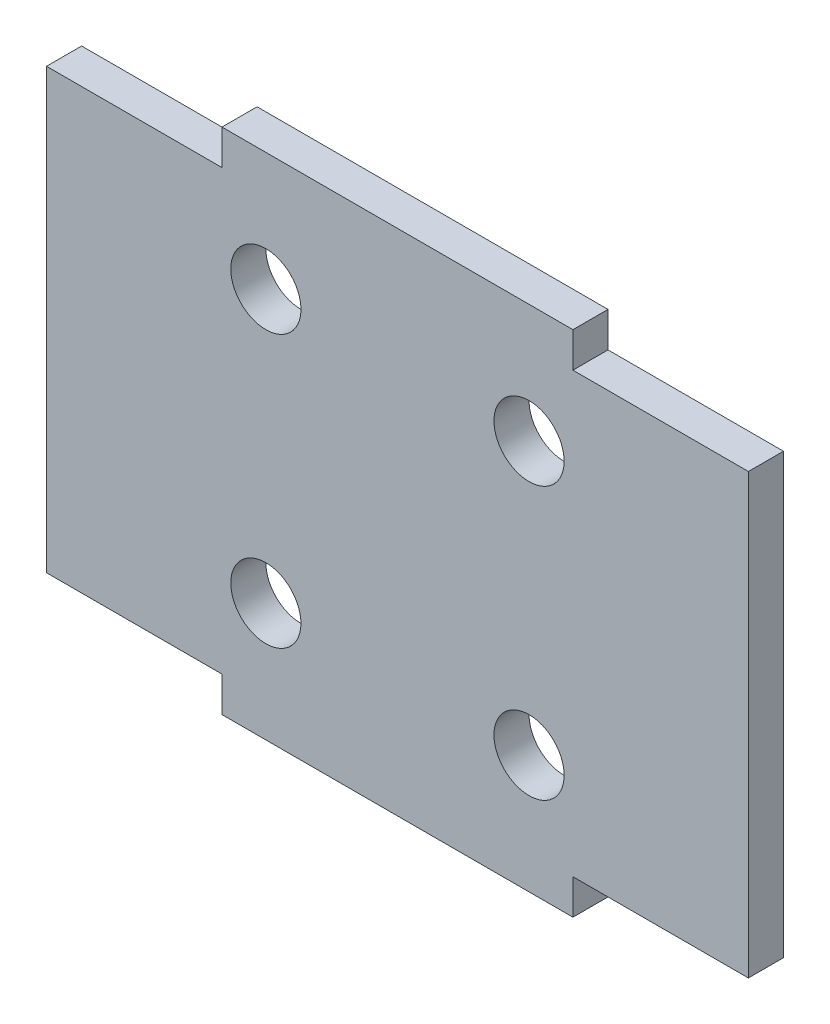
ISO-10303-21;
HEADER;
FILE_DESCRIPTION(('STEP AP214'),'2;1');
FILE_NAME('part.step','',(''),(''),'','','');
FILE_SCHEMA(('AUTOMOTIVE_DESIGN { 1 0 10303 214 1 1 1 1 }'));
ENDSEC;
DATA;
#1=APPLICATION_CONTEXT('core data for automotive mechanical design processes');
#2=APPLICATION_PROTOCOL_DEFINITION('international standard','automotive_design',2000,#1);
#3=PRODUCT_CONTEXT('',#1,'mechanical');
#4=PRODUCT('Part','Part','',(#3));
#5=PRODUCT_RELATED_PRODUCT_CATEGORY('part','',(#4));
#6=PRODUCT_DEFINITION_FORMATION('','',#4);
#7=PRODUCT_DEFINITION_CONTEXT('part definition',#1,'design');
#8=PRODUCT_DEFINITION('design','',#6,#7);
#9=PRODUCT_DEFINITION_SHAPE('','',#8);
#10=(LENGTH_UNIT() NAMED_UNIT(*) SI_UNIT(.MILLI.,.METRE.));
#11=(NAMED_UNIT(*) PLANE_ANGLE_UNIT() SI_UNIT($,.RADIAN.));
#12=(NAMED_UNIT(*) SI_UNIT($,.STERADIAN.) SOLID_ANGLE_UNIT());
#13=UNCERTAINTY_MEASURE_WITH_UNIT(LENGTH_MEASURE(1.E-05),#10,'distance_accuracy_value','');
#14=(GEOMETRIC_REPRESENTATION_CONTEXT(3) GLOBAL_UNCERTAINTY_ASSIGNED_CONTEXT((#13)) GLOBAL_UNIT_ASSIGNED_CONTEXT((#10,
#11,#12)) REPRESENTATION_CONTEXT('',''));
#15=CARTESIAN_POINT('',(0.,0.,0.));
#16=DIRECTION('',(0.,0.,1.));
#17=DIRECTION('',(1.,0.,0.));
#18=AXIS2_PLACEMENT_3D('',#15,#16,#17);
#19=CARTESIAN_POINT('',(0.,0.,4.));
#20=DIRECTION('',(0.,0.,1.));
#21=DIRECTION('',(1.,0.,0.));
#22=AXIS2_PLACEMENT_3D('',#19,#20,#21);
#23=PLANE('',#22);
#24=CARTESIAN_POINT('',(-15.,-15.5,4.));
#25=DIRECTION('',(0.,0.,1.));
#26=DIRECTION('',(1.,0.,0.));
#27=AXIS2_PLACEMENT_3D('',#24,#25,#26);
#28=CIRCLE('',#27,3.99999999999999);
#29=CARTESIAN_POINT('',(-11.,-15.5,4.));
#30=VERTEX_POINT('',#29);
#31=EDGE_CURVE('E180',#30,#30,#28,.T.);
#32=ORIENTED_EDGE('',*,*,#31,.F.);
#33=EDGE_LOOP('',(#32));
#34=FACE_BOUND('',#33,.T.);
#35=CARTESIAN_POINT('',(15.,15.5,4.));
#36=DIRECTION('',(0.,0.,1.));
#37=DIRECTION('',(1.,0.,0.));
#38=AXIS2_PLACEMENT_3D('',#35,#36,#37);
#39=CIRCLE('',#38,4.);
#40=CARTESIAN_POINT('',(19.,15.5,4.));
#41=VERTEX_POINT('',#40);
#42=EDGE_CURVE('E181',#41,#41,#39,.T.);
#43=ORIENTED_EDGE('',*,*,#42,.F.);
#44=EDGE_LOOP('',(#43));
#45=FACE_BOUND('',#44,.T.);
#46=DIRECTION('',(0.,-1.,0.));
#47=VECTOR('',#46,1.);
#48=CARTESIAN_POINT('',(-20.,29.,4.));
#49=LINE('',#48,#47);
#50=CARTESIAN_POINT('',(-20.,29.,4.));
#51=VERTEX_POINT('',#50);
#52=CARTESIAN_POINT('',(-20.,25.,4.));
#53=VERTEX_POINT('',#52);
#54=EDGE_CURVE('E194',#51,#53,#49,.T.);
#55=ORIENTED_EDGE('',*,*,#54,.T.);
#56=DIRECTION('',(-1.,0.,0.));
#57=VECTOR('',#56,1.);
#58=CARTESIAN_POINT('',(-40.,25.,4.));
#59=LINE('',#58,#57);
#60=CARTESIAN_POINT('',(-40.,25.,4.));
#61=VERTEX_POINT('',#60);
#62=EDGE_CURVE('E108',#53,#61,#59,.T.);
#63=ORIENTED_EDGE('',*,*,#62,.T.);
#64=DIRECTION('',(0.,-1.,0.));
#65=VECTOR('',#64,1.);
#66=CARTESIAN_POINT('',(-40.,25.,4.));
#67=LINE('',#66,#65);
#68=CARTESIAN_POINT('',(-40.,-25.,4.));
#69=VERTEX_POINT('',#68);
#70=EDGE_CURVE('E200',#61,#69,#67,.T.);
#71=ORIENTED_EDGE('',*,*,#70,.T.);
#72=DIRECTION('',(1.,0.,0.));
#73=VECTOR('',#72,1.);
#74=CARTESIAN_POINT('',(-40.,-25.,4.));
#75=LINE('',#74,#73);
#76=CARTESIAN_POINT('',(-20.,-25.,4.));
#77=VERTEX_POINT('',#76);
#78=EDGE_CURVE('E204',#69,#77,#75,.T.);
#79=ORIENTED_EDGE('',*,*,#78,.T.);
#80=DIRECTION('',(0.,-1.,0.));
#81=VECTOR('',#80,1.);
#82=CARTESIAN_POINT('',(-20.,-29.,4.));
#83=LINE('',#82,#81);
#84=CARTESIAN_POINT('',(-20.,-29.,4.));
#85=VERTEX_POINT('',#84);
#86=EDGE_CURVE('E212',#77,#85,#83,.T.);
#87=ORIENTED_EDGE('',*,*,#86,.T.);
#88=DIRECTION('',(1.,0.,0.));
#89=VECTOR('',#88,1.);
#90=CARTESIAN_POINT('',(-20.,-29.,4.));
#91=LINE('',#90,#89);
#92=CARTESIAN_POINT('',(20.,-29.,4.));
#93=VERTEX_POINT('',#92);
#94=EDGE_CURVE('E215',#85,#93,#91,.T.);
#95=ORIENTED_EDGE('',*,*,#94,.T.);
#96=DIRECTION('',(0.,1.,0.));
#97=VECTOR('',#96,1.);
#98=CARTESIAN_POINT('',(20.,-29.,4.));
#99=LINE('',#98,#97);
#100=CARTESIAN_POINT('',(20.,-25.,4.));
#101=VERTEX_POINT('',#100);
#102=EDGE_CURVE('E219',#93,#101,#99,.T.);
#103=ORIENTED_EDGE('',*,*,#102,.T.);
#104=DIRECTION('',(1.,0.,0.));
#105=VECTOR('',#104,1.);
#106=CARTESIAN_POINT('',(40.,-25.,4.));
#107=LINE('',#106,#105);
#108=CARTESIAN_POINT('',(40.,-25.,4.));
#109=VERTEX_POINT('',#108);
#110=EDGE_CURVE('E223',#101,#109,#107,.T.);
#111=ORIENTED_EDGE('',*,*,#110,.T.);
#112=DIRECTION('',(0.,1.,0.));
#113=VECTOR('',#112,1.);
#114=CARTESIAN_POINT('',(40.,25.,4.));
#115=LINE('',#114,#113);
#116=CARTESIAN_POINT('',(40.,25.,4.));
#117=VERTEX_POINT('',#116);
#118=EDGE_CURVE('E139',#109,#117,#115,.T.);
#119=ORIENTED_EDGE('',*,*,#118,.T.);
#120=DIRECTION('',(-1.,0.,0.));
#121=VECTOR('',#120,1.);
#122=CARTESIAN_POINT('',(40.,25.,4.));
#123=LINE('',#122,#121);
#124=CARTESIAN_POINT('',(20.,25.,4.));
#125=VERTEX_POINT('',#124);
#126=EDGE_CURVE('E133',#117,#125,#123,.T.);
#127=ORIENTED_EDGE('',*,*,#126,.T.);
#128=DIRECTION('',(0.,1.,0.));
#129=VECTOR('',#128,1.);
#130=CARTESIAN_POINT('',(20.,29.,4.));
#131=LINE('',#130,#129);
#132=CARTESIAN_POINT('',(20.,29.,4.));
#133=VERTEX_POINT('',#132);
#134=EDGE_CURVE('E137',#125,#133,#131,.T.);
#135=ORIENTED_EDGE('',*,*,#134,.T.);
#136=DIRECTION('',(-1.,0.,0.));
#137=VECTOR('',#136,1.);
#138=CARTESIAN_POINT('',(-20.,29.,4.));
#139=LINE('',#138,#137);
#140=EDGE_CURVE('E53',#133,#51,#139,.T.);
#141=ORIENTED_EDGE('',*,*,#140,.T.);
#142=EDGE_LOOP('',(#55,#63,#71,#79,#87,#95,#103,#111,#119,#127,#135,#141));
#143=FACE_BOUND('',#142,.T.);
#144=CARTESIAN_POINT('',(-15.,15.5,4.));
#145=DIRECTION('',(0.,0.,1.));
#146=DIRECTION('',(-1.,0.,0.));
#147=AXIS2_PLACEMENT_3D('',#144,#145,#146);
#148=CIRCLE('',#147,4.);
#149=CARTESIAN_POINT('',(-19.,15.5,4.));
#150=VERTEX_POINT('',#149);
#151=EDGE_CURVE('E168',#150,#150,#148,.T.);
#152=ORIENTED_EDGE('',*,*,#151,.F.);
#153=EDGE_LOOP('',(#152));
#154=FACE_BOUND('',#153,.T.);
#155=CARTESIAN_POINT('',(15.,-15.5,4.));
#156=DIRECTION('',(0.,0.,1.));
#157=DIRECTION('',(-1.,0.,0.));
#158=AXIS2_PLACEMENT_3D('',#155,#156,#157);
#159=CIRCLE('',#158,4.);
#160=CARTESIAN_POINT('',(11.,-15.5,4.));
#161=VERTEX_POINT('',#160);
#162=EDGE_CURVE('E307',#161,#161,#159,.T.);
#163=ORIENTED_EDGE('',*,*,#162,.F.);
#164=EDGE_LOOP('',(#163));
#165=FACE_BOUND('',#164,.T.);
#166=ADVANCED_FACE('F36',(#34,#45,#143,#154,#165),#23,.T.);
#167=CARTESIAN_POINT('',(0.,0.,0.));
#168=DIRECTION('',(0.,0.,1.));
#169=DIRECTION('',(1.,0.,0.));
#170=AXIS2_PLACEMENT_3D('',#167,#168,#169);
#171=PLANE('',#170);
#172=DIRECTION('',(0.,-1.,0.));
#173=VECTOR('',#172,1.);
#174=CARTESIAN_POINT('',(-20.,29.,0.));
#175=LINE('',#174,#173);
#176=CARTESIAN_POINT('',(-20.,29.,0.));
#177=VERTEX_POINT('',#176);
#178=CARTESIAN_POINT('',(-20.,25.,0.));
#179=VERTEX_POINT('',#178);
#180=EDGE_CURVE('E186',#177,#179,#175,.T.);
#181=ORIENTED_EDGE('',*,*,#180,.F.);
#182=DIRECTION('',(-1.,0.,0.));
#183=VECTOR('',#182,1.);
#184=CARTESIAN_POINT('',(-20.,29.,0.));
#185=LINE('',#184,#183);
#186=CARTESIAN_POINT('',(20.,29.,0.));
#187=VERTEX_POINT('',#186);
#188=EDGE_CURVE('E100',#187,#177,#185,.T.);
#189=ORIENTED_EDGE('',*,*,#188,.F.);
#190=DIRECTION('',(0.,1.,0.));
#191=VECTOR('',#190,1.);
#192=CARTESIAN_POINT('',(20.,29.,0.));
#193=LINE('',#192,#191);
#194=CARTESIAN_POINT('',(20.,25.,0.));
#195=VERTEX_POINT('',#194);
#196=EDGE_CURVE('E94',#195,#187,#193,.T.);
#197=ORIENTED_EDGE('',*,*,#196,.F.);
#198=DIRECTION('',(-1.,0.,0.));
#199=VECTOR('',#198,1.);
#200=CARTESIAN_POINT('',(40.,25.,0.));
#201=LINE('',#200,#199);
#202=CARTESIAN_POINT('',(40.,25.,0.));
#203=VERTEX_POINT('',#202);
#204=EDGE_CURVE('E148',#203,#195,#201,.T.);
#205=ORIENTED_EDGE('',*,*,#204,.F.);
#206=DIRECTION('',(0.,1.,0.));
#207=VECTOR('',#206,1.);
#208=CARTESIAN_POINT('',(40.,25.,0.));
#209=LINE('',#208,#207);
#210=CARTESIAN_POINT('',(40.,-25.,0.));
#211=VERTEX_POINT('',#210);
#212=EDGE_CURVE('E245',#211,#203,#209,.T.);
#213=ORIENTED_EDGE('',*,*,#212,.F.);
#214=DIRECTION('',(1.,0.,0.));
#215=VECTOR('',#214,1.);
#216=CARTESIAN_POINT('',(40.,-25.,0.));
#217=LINE('',#216,#215);
#218=CARTESIAN_POINT('',(20.,-25.,0.));
#219=VERTEX_POINT('',#218);
#220=EDGE_CURVE('E239',#219,#211,#217,.T.);
#221=ORIENTED_EDGE('',*,*,#220,.F.);
#222=DIRECTION('',(0.,1.,0.));
#223=VECTOR('',#222,1.);
#224=CARTESIAN_POINT('',(20.,-29.,0.));
#225=LINE('',#224,#223);
#226=CARTESIAN_POINT('',(20.,-29.,0.));
#227=VERTEX_POINT('',#226);
#228=EDGE_CURVE('E284',#227,#219,#225,.T.);
#229=ORIENTED_EDGE('',*,*,#228,.F.);
#230=DIRECTION('',(1.,0.,0.));
#231=VECTOR('',#230,1.);
#232=CARTESIAN_POINT('',(-20.,-29.,0.));
#233=LINE('',#232,#231);
#234=CARTESIAN_POINT('',(-20.,-29.,0.));
#235=VERTEX_POINT('',#234);
#236=EDGE_CURVE('E282',#235,#227,#233,.T.);
#237=ORIENTED_EDGE('',*,*,#236,.F.);
#238=DIRECTION('',(0.,-1.,0.));
#239=VECTOR('',#238,1.);
#240=CARTESIAN_POINT('',(-20.,-29.,0.));
#241=LINE('',#240,#239);
#242=CARTESIAN_POINT('',(-20.,-25.,0.));
#243=VERTEX_POINT('',#242);
#244=EDGE_CURVE('E277',#243,#235,#241,.T.);
#245=ORIENTED_EDGE('',*,*,#244,.F.);
#246=DIRECTION('',(1.,0.,0.));
#247=VECTOR('',#246,1.);
#248=CARTESIAN_POINT('',(-40.,-25.,0.));
#249=LINE('',#248,#247);
#250=CARTESIAN_POINT('',(-40.,-25.,0.));
#251=VERTEX_POINT('',#250);
#252=EDGE_CURVE('E275',#251,#243,#249,.T.);
#253=ORIENTED_EDGE('',*,*,#252,.F.);
#254=DIRECTION('',(0.,-1.,0.));
#255=VECTOR('',#254,1.);
#256=CARTESIAN_POINT('',(-40.,25.,0.));
#257=LINE('',#256,#255);
#258=CARTESIAN_POINT('',(-40.,25.,0.));
#259=VERTEX_POINT('',#258);
#260=EDGE_CURVE('E267',#259,#251,#257,.T.);
#261=ORIENTED_EDGE('',*,*,#260,.F.);
#262=DIRECTION('',(-1.,0.,0.));
#263=VECTOR('',#262,1.);
#264=CARTESIAN_POINT('',(-40.,25.,0.));
#265=LINE('',#264,#263);
#266=EDGE_CURVE('E273',#179,#259,#265,.T.);
#267=ORIENTED_EDGE('',*,*,#266,.F.);
#268=EDGE_LOOP('',(#181,#189,#197,#205,#213,#221,#229,#237,#245,#253,#261,#267));
#269=FACE_BOUND('',#268,.T.);
#270=CARTESIAN_POINT('',(15.,15.5,0.));
#271=DIRECTION('',(0.,0.,1.));
#272=DIRECTION('',(1.,0.,0.));
#273=AXIS2_PLACEMENT_3D('',#270,#271,#272);
#274=CIRCLE('',#273,4.);
#275=CARTESIAN_POINT('',(19.,15.5,0.));
#276=VERTEX_POINT('',#275);
#277=EDGE_CURVE('E174',#276,#276,#274,.T.);
#278=ORIENTED_EDGE('',*,*,#277,.T.);
#279=EDGE_LOOP('',(#278));
#280=FACE_BOUND('',#279,.T.);
#281=CARTESIAN_POINT('',(-15.,15.5,0.));
#282=DIRECTION('',(0.,0.,1.));
#283=DIRECTION('',(-1.,0.,0.));
#284=AXIS2_PLACEMENT_3D('',#281,#282,#283);
#285=CIRCLE('',#284,4.);
#286=CARTESIAN_POINT('',(-19.,15.5,0.));
#287=VERTEX_POINT('',#286);
#288=EDGE_CURVE('E175',#287,#287,#285,.T.);
#289=ORIENTED_EDGE('',*,*,#288,.T.);
#290=EDGE_LOOP('',(#289));
#291=FACE_BOUND('',#290,.T.);
#292=CARTESIAN_POINT('',(-15.,-15.5,0.));
#293=DIRECTION('',(0.,0.,1.));
#294=DIRECTION('',(1.,0.,0.));
#295=AXIS2_PLACEMENT_3D('',#292,#293,#294);
#296=CIRCLE('',#295,3.99999999999999);
#297=CARTESIAN_POINT('',(-11.,-15.5,0.));
#298=VERTEX_POINT('',#297);
#299=EDGE_CURVE('E176',#298,#298,#296,.T.);
#300=ORIENTED_EDGE('',*,*,#299,.T.);
#301=EDGE_LOOP('',(#300));
#302=FACE_BOUND('',#301,.T.);
#303=CARTESIAN_POINT('',(15.,-15.5,0.));
#304=DIRECTION('',(0.,0.,1.));
#305=DIRECTION('',(-1.,0.,0.));
#306=AXIS2_PLACEMENT_3D('',#303,#304,#305);
#307=CIRCLE('',#306,4.);
#308=CARTESIAN_POINT('',(11.,-15.5,0.));
#309=VERTEX_POINT('',#308);
#310=EDGE_CURVE('E310',#309,#309,#307,.T.);
#311=ORIENTED_EDGE('',*,*,#310,.T.);
#312=EDGE_LOOP('',(#311));
#313=FACE_BOUND('',#312,.T.);
#314=ADVANCED_FACE('F271',(#269,#280,#291,#302,#313),#171,.F.);
#315=CARTESIAN_POINT('',(-20.,29.,4.));
#316=DIRECTION('',(1.,0.,0.));
#317=DIRECTION('',(0.,0.,-1.));
#318=AXIS2_PLACEMENT_3D('',#315,#316,#317);
#319=PLANE('',#318);
#320=ORIENTED_EDGE('',*,*,#180,.T.);
#321=DIRECTION('',(0.,0.,-1.));
#322=VECTOR('',#321,1.);
#323=CARTESIAN_POINT('',(-20.,25.,4.));
#324=LINE('',#323,#322);
#325=EDGE_CURVE('E12',#53,#179,#324,.T.);
#326=ORIENTED_EDGE('',*,*,#325,.F.);
#327=ORIENTED_EDGE('',*,*,#54,.F.);
#328=DIRECTION('',(0.,0.,-1.));
#329=VECTOR('',#328,1.);
#330=CARTESIAN_POINT('',(-20.,29.,4.));
#331=LINE('',#330,#329);
#332=EDGE_CURVE('E156',#51,#177,#331,.T.);
#333=ORIENTED_EDGE('',*,*,#332,.T.);
#334=EDGE_LOOP('',(#320,#326,#327,#333));
#335=FACE_BOUND('',#334,.T.);
#336=ADVANCED_FACE('F38',(#335),#319,.F.);
#337=CARTESIAN_POINT('',(-40.,25.,4.));
#338=DIRECTION('',(0.,-1.,0.));
#339=DIRECTION('',(0.,0.,-1.));
#340=AXIS2_PLACEMENT_3D('',#337,#338,#339);
#341=PLANE('',#340);
#342=ORIENTED_EDGE('',*,*,#266,.T.);
#343=DIRECTION('',(0.,0.,-1.));
#344=VECTOR('',#343,1.);
#345=CARTESIAN_POINT('',(-40.,25.,4.));
#346=LINE('',#345,#344);
#347=EDGE_CURVE('E45',#61,#259,#346,.T.);
#348=ORIENTED_EDGE('',*,*,#347,.F.);
#349=ORIENTED_EDGE('',*,*,#62,.F.);
#350=ORIENTED_EDGE('',*,*,#325,.T.);
#351=EDGE_LOOP('',(#342,#348,#349,#350));
#352=FACE_BOUND('',#351,.T.);
#353=ADVANCED_FACE('F357',(#352),#341,.F.);
#354=CARTESIAN_POINT('',(-40.,25.,4.));
#355=DIRECTION('',(1.,0.,0.));
#356=DIRECTION('',(0.,0.,-1.));
#357=AXIS2_PLACEMENT_3D('',#354,#355,#356);
#358=PLANE('',#357);
#359=ORIENTED_EDGE('',*,*,#260,.T.);
#360=DIRECTION('',(0.,0.,-1.));
#361=VECTOR('',#360,1.);
#362=CARTESIAN_POINT('',(-40.,-25.,4.));
#363=LINE('',#362,#361);
#364=EDGE_CURVE('E259',#69,#251,#363,.T.);
#365=ORIENTED_EDGE('',*,*,#364,.F.);
#366=ORIENTED_EDGE('',*,*,#70,.F.);
#367=ORIENTED_EDGE('',*,*,#347,.T.);
#368=EDGE_LOOP('',(#359,#365,#366,#367));
#369=FACE_BOUND('',#368,.T.);
#370=ADVANCED_FACE('F265',(#369),#358,.F.);
#371=CARTESIAN_POINT('',(-40.,-25.,4.));
#372=DIRECTION('',(0.,1.,0.));
#373=DIRECTION('',(0.,0.,1.));
#374=AXIS2_PLACEMENT_3D('',#371,#372,#373);
#375=PLANE('',#374);
#376=ORIENTED_EDGE('',*,*,#252,.T.);
#377=DIRECTION('',(0.,0.,-1.));
#378=VECTOR('',#377,1.);
#379=CARTESIAN_POINT('',(-20.,-25.,4.));
#380=LINE('',#379,#378);
#381=EDGE_CURVE('E256',#77,#243,#380,.T.);
#382=ORIENTED_EDGE('',*,*,#381,.F.);
#383=ORIENTED_EDGE('',*,*,#78,.F.);
#384=ORIENTED_EDGE('',*,*,#364,.T.);
#385=EDGE_LOOP('',(#376,#382,#383,#384));
#386=FACE_BOUND('',#385,.T.);
#387=ADVANCED_FACE('F299',(#386),#375,.F.);
#388=CARTESIAN_POINT('',(-20.,-29.,4.));
#389=DIRECTION('',(1.,0.,0.));
#390=DIRECTION('',(0.,0.,-1.));
#391=AXIS2_PLACEMENT_3D('',#388,#389,#390);
#392=PLANE('',#391);
#393=ORIENTED_EDGE('',*,*,#244,.T.);
#394=DIRECTION('',(0.,0.,-1.));
#395=VECTOR('',#394,1.);
#396=CARTESIAN_POINT('',(-20.,-29.,4.));
#397=LINE('',#396,#395);
#398=EDGE_CURVE('E253',#85,#235,#397,.T.);
#399=ORIENTED_EDGE('',*,*,#398,.F.);
#400=ORIENTED_EDGE('',*,*,#86,.F.);
#401=ORIENTED_EDGE('',*,*,#381,.T.);
#402=EDGE_LOOP('',(#393,#399,#400,#401));
#403=FACE_BOUND('',#402,.T.);
#404=ADVANCED_FACE('F349',(#403),#392,.F.);
#405=CARTESIAN_POINT('',(-20.,-29.,4.));
#406=DIRECTION('',(0.,1.,0.));
#407=DIRECTION('',(0.,0.,1.));
#408=AXIS2_PLACEMENT_3D('',#405,#406,#407);
#409=PLANE('',#408);
#410=ORIENTED_EDGE('',*,*,#236,.T.);
#411=DIRECTION('',(0.,0.,-1.));
#412=VECTOR('',#411,1.);
#413=CARTESIAN_POINT('',(20.,-29.,4.));
#414=LINE('',#413,#412);
#415=EDGE_CURVE('E250',#93,#227,#414,.T.);
#416=ORIENTED_EDGE('',*,*,#415,.F.);
#417=ORIENTED_EDGE('',*,*,#94,.F.);
#418=ORIENTED_EDGE('',*,*,#398,.T.);
#419=EDGE_LOOP('',(#410,#416,#417,#418));
#420=FACE_BOUND('',#419,.T.);
#421=ADVANCED_FACE('F345',(#420),#409,.F.);
#422=CARTESIAN_POINT('',(20.,-29.,4.));
#423=DIRECTION('',(-1.,0.,0.));
#424=DIRECTION('',(0.,0.,1.));
#425=AXIS2_PLACEMENT_3D('',#422,#423,#424);
#426=PLANE('',#425);
#427=ORIENTED_EDGE('',*,*,#228,.T.);
#428=DIRECTION('',(0.,0.,-1.));
#429=VECTOR('',#428,1.);
#430=CARTESIAN_POINT('',(20.,-25.,4.));
#431=LINE('',#430,#429);
#432=EDGE_CURVE('E242',#101,#219,#431,.T.);
#433=ORIENTED_EDGE('',*,*,#432,.F.);
#434=ORIENTED_EDGE('',*,*,#102,.F.);
#435=ORIENTED_EDGE('',*,*,#415,.T.);
#436=EDGE_LOOP('',(#427,#433,#434,#435));
#437=FACE_BOUND('',#436,.T.);
#438=ADVANCED_FACE('F342',(#437),#426,.F.);
#439=CARTESIAN_POINT('',(40.,-25.,4.));
#440=DIRECTION('',(0.,1.,0.));
#441=DIRECTION('',(0.,0.,1.));
#442=AXIS2_PLACEMENT_3D('',#439,#440,#441);
#443=PLANE('',#442);
#444=ORIENTED_EDGE('',*,*,#220,.T.);
#445=DIRECTION('',(0.,0.,-1.));
#446=VECTOR('',#445,1.);
#447=CARTESIAN_POINT('',(40.,-25.,4.));
#448=LINE('',#447,#446);
#449=EDGE_CURVE('E236',#109,#211,#448,.T.);
#450=ORIENTED_EDGE('',*,*,#449,.F.);
#451=ORIENTED_EDGE('',*,*,#110,.F.);
#452=ORIENTED_EDGE('',*,*,#432,.T.);
#453=EDGE_LOOP('',(#444,#450,#451,#452));
#454=FACE_BOUND('',#453,.T.);
#455=ADVANCED_FACE('F237',(#454),#443,.F.);
#456=CARTESIAN_POINT('',(40.,25.,4.));
#457=DIRECTION('',(-1.,0.,0.));
#458=DIRECTION('',(0.,0.,1.));
#459=AXIS2_PLACEMENT_3D('',#456,#457,#458);
#460=PLANE('',#459);
#461=ORIENTED_EDGE('',*,*,#212,.T.);
#462=DIRECTION('',(0.,0.,-1.));
#463=VECTOR('',#462,1.);
#464=CARTESIAN_POINT('',(40.,25.,4.));
#465=LINE('',#464,#463);
#466=EDGE_CURVE('E149',#117,#203,#465,.T.);
#467=ORIENTED_EDGE('',*,*,#466,.F.);
#468=ORIENTED_EDGE('',*,*,#118,.F.);
#469=ORIENTED_EDGE('',*,*,#449,.T.);
#470=EDGE_LOOP('',(#461,#467,#468,#469));
#471=FACE_BOUND('',#470,.T.);
#472=ADVANCED_FACE('F244',(#471),#460,.F.);
#473=CARTESIAN_POINT('',(40.,25.,4.));
#474=DIRECTION('',(0.,-1.,0.));
#475=DIRECTION('',(0.,0.,-1.));
#476=AXIS2_PLACEMENT_3D('',#473,#474,#475);
#477=PLANE('',#476);
#478=ORIENTED_EDGE('',*,*,#204,.T.);
#479=DIRECTION('',(0.,0.,-1.));
#480=VECTOR('',#479,1.);
#481=CARTESIAN_POINT('',(20.,25.,4.));
#482=LINE('',#481,#480);
#483=EDGE_CURVE('E145',#125,#195,#482,.T.);
#484=ORIENTED_EDGE('',*,*,#483,.F.);
#485=ORIENTED_EDGE('',*,*,#126,.F.);
#486=ORIENTED_EDGE('',*,*,#466,.T.);
#487=EDGE_LOOP('',(#478,#484,#485,#486));
#488=FACE_BOUND('',#487,.T.);
#489=ADVANCED_FACE('F146',(#488),#477,.F.);
#490=CARTESIAN_POINT('',(20.,29.,4.));
#491=DIRECTION('',(-1.,0.,0.));
#492=DIRECTION('',(0.,0.,1.));
#493=AXIS2_PLACEMENT_3D('',#490,#491,#492);
#494=PLANE('',#493);
#495=ORIENTED_EDGE('',*,*,#196,.T.);
#496=DIRECTION('',(0.,0.,-1.));
#497=VECTOR('',#496,1.);
#498=CARTESIAN_POINT('',(20.,29.,4.));
#499=LINE('',#498,#497);
#500=EDGE_CURVE('E150',#133,#187,#499,.T.);
#501=ORIENTED_EDGE('',*,*,#500,.F.);
#502=ORIENTED_EDGE('',*,*,#134,.F.);
#503=ORIENTED_EDGE('',*,*,#483,.T.);
#504=EDGE_LOOP('',(#495,#501,#502,#503));
#505=FACE_BOUND('',#504,.T.);
#506=ADVANCED_FACE('F152',(#505),#494,.F.);
#507=CARTESIAN_POINT('',(-20.,29.,4.));
#508=DIRECTION('',(0.,-1.,0.));
#509=DIRECTION('',(0.,0.,-1.));
#510=AXIS2_PLACEMENT_3D('',#507,#508,#509);
#511=PLANE('',#510);
#512=ORIENTED_EDGE('',*,*,#188,.T.);
#513=ORIENTED_EDGE('',*,*,#332,.F.);
#514=ORIENTED_EDGE('',*,*,#140,.F.);
#515=ORIENTED_EDGE('',*,*,#500,.T.);
#516=EDGE_LOOP('',(#512,#513,#514,#515));
#517=FACE_BOUND('',#516,.T.);
#518=ADVANCED_FACE('F291',(#517),#511,.F.);
#519=CARTESIAN_POINT('',(15.,15.5,4.));
#520=DIRECTION('',(0.,0.,-1.));
#521=DIRECTION('',(-1.,0.,0.));
#522=AXIS2_PLACEMENT_3D('',#519,#520,#521);
#523=CYLINDRICAL_SURFACE('',#522,4.);
#524=ORIENTED_EDGE('',*,*,#42,.T.);
#525=EDGE_LOOP('',(#524));
#526=FACE_BOUND('',#525,.T.);
#527=ORIENTED_EDGE('',*,*,#277,.F.);
#528=EDGE_LOOP('',(#527));
#529=FACE_BOUND('',#528,.T.);
#530=ADVANCED_FACE('F329',(#526,#529),#523,.F.);
#531=CARTESIAN_POINT('',(-15.,15.5,4.));
#532=DIRECTION('',(0.,0.,-1.));
#533=DIRECTION('',(-1.,0.,0.));
#534=AXIS2_PLACEMENT_3D('',#531,#532,#533);
#535=CYLINDRICAL_SURFACE('',#534,4.);
#536=ORIENTED_EDGE('',*,*,#151,.T.);
#537=EDGE_LOOP('',(#536));
#538=FACE_BOUND('',#537,.T.);
#539=ORIENTED_EDGE('',*,*,#288,.F.);
#540=EDGE_LOOP('',(#539));
#541=FACE_BOUND('',#540,.T.);
#542=ADVANCED_FACE('F438',(#538,#541),#535,.F.);
#543=CARTESIAN_POINT('',(-15.,-15.5,4.));
#544=DIRECTION('',(0.,0.,-1.));
#545=DIRECTION('',(-1.,0.,0.));
#546=AXIS2_PLACEMENT_3D('',#543,#544,#545);
#547=CYLINDRICAL_SURFACE('',#546,3.99999999999999);
#548=ORIENTED_EDGE('',*,*,#31,.T.);
#549=EDGE_LOOP('',(#548));
#550=FACE_BOUND('',#549,.T.);
#551=ORIENTED_EDGE('',*,*,#299,.F.);
#552=EDGE_LOOP('',(#551));
#553=FACE_BOUND('',#552,.T.);
#554=ADVANCED_FACE('F446',(#550,#553),#547,.F.);
#555=CARTESIAN_POINT('',(15.,-15.5,4.));
#556=DIRECTION('',(0.,0.,-1.));
#557=DIRECTION('',(-1.,0.,0.));
#558=AXIS2_PLACEMENT_3D('',#555,#556,#557);
#559=CYLINDRICAL_SURFACE('',#558,4.);
#560=ORIENTED_EDGE('',*,*,#162,.T.);
#561=EDGE_LOOP('',(#560));
#562=FACE_BOUND('',#561,.T.);
#563=ORIENTED_EDGE('',*,*,#310,.F.);
#564=EDGE_LOOP('',(#563));
#565=FACE_BOUND('',#564,.T.);
#566=ADVANCED_FACE('F317',(#562,#565),#559,.F.);
#567=CLOSED_SHELL('',(#166,#314,#336,#353,#370,#387,#404,#421,#438,#455,#472,#489,#506,#518,
#530,#542,#554,#566));
#568=MANIFOLD_SOLID_BREP('B2',#567);
#569=ADVANCED_BREP_SHAPE_REPRESENTATION('',(#18,#568),#14);
#570=SHAPE_DEFINITION_REPRESENTATION(#9,#569);
ENDSEC;
END-ISO-10303-21;
